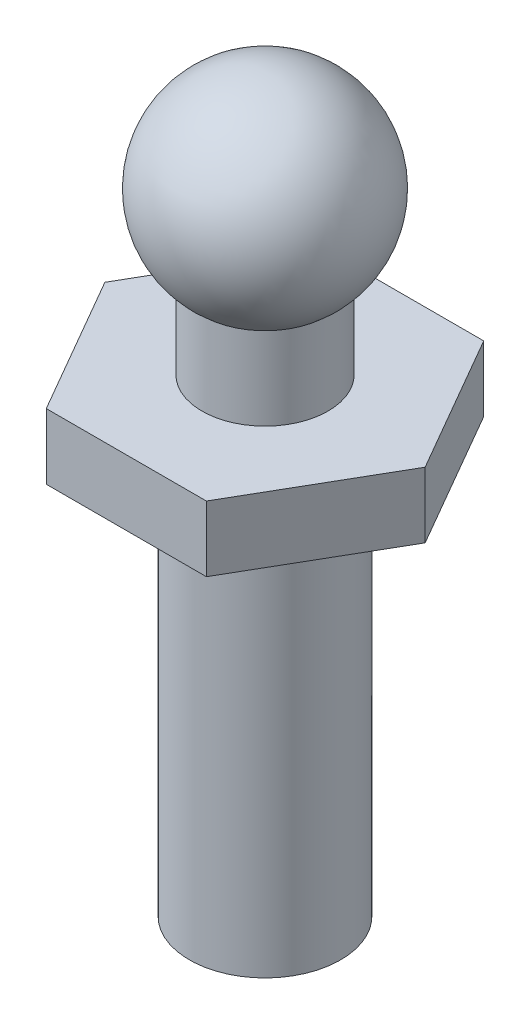
ISO-10303-21;
HEADER;
FILE_DESCRIPTION(('STEP AP214'),'2;1');
FILE_NAME('part.step','',(''),(''),'','','');
FILE_SCHEMA(('AUTOMOTIVE_DESIGN { 1 0 10303 214 1 1 1 1 }'));
ENDSEC;
DATA;
#1=APPLICATION_CONTEXT('core data for automotive mechanical design processes');
#2=APPLICATION_PROTOCOL_DEFINITION('international standard','automotive_design',2000,#1);
#3=PRODUCT_CONTEXT('',#1,'mechanical');
#4=PRODUCT('Part','Part','',(#3));
#5=PRODUCT_RELATED_PRODUCT_CATEGORY('part','',(#4));
#6=PRODUCT_DEFINITION_FORMATION('','',#4);
#7=PRODUCT_DEFINITION_CONTEXT('part definition',#1,'design');
#8=PRODUCT_DEFINITION('design','',#6,#7);
#9=PRODUCT_DEFINITION_SHAPE('','',#8);
#10=(LENGTH_UNIT() NAMED_UNIT(*) SI_UNIT(.MILLI.,.METRE.));
#11=(NAMED_UNIT(*) PLANE_ANGLE_UNIT() SI_UNIT($,.RADIAN.));
#12=(NAMED_UNIT(*) SI_UNIT($,.STERADIAN.) SOLID_ANGLE_UNIT());
#13=UNCERTAINTY_MEASURE_WITH_UNIT(LENGTH_MEASURE(1.E-05),#10,'distance_accuracy_value','');
#14=(GEOMETRIC_REPRESENTATION_CONTEXT(3) GLOBAL_UNCERTAINTY_ASSIGNED_CONTEXT((#13)) GLOBAL_UNIT_ASSIGNED_CONTEXT((#10,
#11,#12)) REPRESENTATION_CONTEXT('',''));
#15=CARTESIAN_POINT('',(0.,0.,0.));
#16=DIRECTION('',(0.,0.,1.));
#17=DIRECTION('',(1.,0.,0.));
#18=AXIS2_PLACEMENT_3D('',#15,#16,#17);
#19=CARTESIAN_POINT('',(0.,-12.5,0.));
#20=DIRECTION('',(0.,-1.,0.));
#21=DIRECTION('',(0.,0.,-1.));
#22=AXIS2_PLACEMENT_3D('',#19,#20,#21);
#23=PLANE('',#22);
#24=CARTESIAN_POINT('',(0.,-12.5,0.));
#25=DIRECTION('',(0.,-1.,0.));
#26=DIRECTION('',(0.,0.,-1.));
#27=AXIS2_PLACEMENT_3D('',#24,#25,#26);
#28=CIRCLE('',#27,1.5);
#29=CARTESIAN_POINT('',(0.,-12.5,-1.5));
#30=VERTEX_POINT('',#29);
#31=EDGE_CURVE('E11',#30,#30,#28,.T.);
#32=ORIENTED_EDGE('',*,*,#31,.T.);
#33=EDGE_LOOP('',(#32));
#34=FACE_BOUND('',#33,.T.);
#35=ADVANCED_FACE('F32',(#34),#23,.T.);
#36=CARTESIAN_POINT('',(0.,0.,0.));
#37=DIRECTION('',(0.,-1.,0.));
#38=DIRECTION('',(0.,0.,-1.));
#39=AXIS2_PLACEMENT_3D('',#36,#37,#38);
#40=CYLINDRICAL_SURFACE('',#39,1.5);
#41=CARTESIAN_POINT('',(0.,-4.5,0.));
#42=DIRECTION('',(0.,-1.,0.));
#43=DIRECTION('',(0.,0.,-1.));
#44=AXIS2_PLACEMENT_3D('',#41,#42,#43);
#45=CIRCLE('',#44,1.5);
#46=CARTESIAN_POINT('',(0.,-4.5,-1.5));
#47=VERTEX_POINT('',#46);
#48=EDGE_CURVE('E41',#47,#47,#45,.T.);
#49=ORIENTED_EDGE('',*,*,#48,.T.);
#50=EDGE_LOOP('',(#49));
#51=FACE_BOUND('',#50,.T.);
#52=ORIENTED_EDGE('',*,*,#31,.F.);
#53=EDGE_LOOP('',(#52));
#54=FACE_BOUND('',#53,.T.);
#55=ADVANCED_FACE('F125',(#51,#54),#40,.T.);
#56=CARTESIAN_POINT('',(1.5,-4.5,0.));
#57=DIRECTION('',(0.,-1.,0.));
#58=DIRECTION('',(0.,0.,-1.));
#59=AXIS2_PLACEMENT_3D('',#56,#57,#58);
#60=PLANE('',#59);
#61=DIRECTION('',(-0.5,0.,0.866025403784439));
#62=VECTOR('',#61,1.);
#63=CARTESIAN_POINT('',(-1.58771324027147,-4.5,-2.75));
#64=LINE('',#63,#62);
#65=CARTESIAN_POINT('',(-1.58771324027147,-4.5,-2.75));
#66=VERTEX_POINT('',#65);
#67=CARTESIAN_POINT('',(-3.17542648054294,-4.5,0.));
#68=VERTEX_POINT('',#67);
#69=EDGE_CURVE('E76',#66,#68,#64,.T.);
#70=ORIENTED_EDGE('',*,*,#69,.F.);
#71=DIRECTION('',(-1.,0.,0.));
#72=VECTOR('',#71,1.);
#73=CARTESIAN_POINT('',(1.58771324027147,-4.5,-2.75));
#74=LINE('',#73,#72);
#75=CARTESIAN_POINT('',(1.58771324027147,-4.5,-2.75));
#76=VERTEX_POINT('',#75);
#77=EDGE_CURVE('E106',#76,#66,#74,.T.);
#78=ORIENTED_EDGE('',*,*,#77,.F.);
#79=DIRECTION('',(-0.5,0.,-0.866025403784438));
#80=VECTOR('',#79,1.);
#81=CARTESIAN_POINT('',(3.17542648054294,-4.5,0.));
#82=LINE('',#81,#80);
#83=CARTESIAN_POINT('',(3.17542648054294,-4.5,0.));
#84=VERTEX_POINT('',#83);
#85=EDGE_CURVE('E117',#84,#76,#82,.T.);
#86=ORIENTED_EDGE('',*,*,#85,.F.);
#87=DIRECTION('',(0.5,0.,-0.866025403784439));
#88=VECTOR('',#87,1.);
#89=CARTESIAN_POINT('',(1.58771324027147,-4.5,2.75));
#90=LINE('',#89,#88);
#91=CARTESIAN_POINT('',(1.58771324027147,-4.5,2.75));
#92=VERTEX_POINT('',#91);
#93=EDGE_CURVE('E257',#92,#84,#90,.T.);
#94=ORIENTED_EDGE('',*,*,#93,.F.);
#95=DIRECTION('',(1.,0.,0.));
#96=VECTOR('',#95,1.);
#97=CARTESIAN_POINT('',(-1.58771324027147,-4.5,2.75));
#98=LINE('',#97,#96);
#99=CARTESIAN_POINT('',(-1.58771324027147,-4.5,2.75));
#100=VERTEX_POINT('',#99);
#101=EDGE_CURVE('E264',#100,#92,#98,.T.);
#102=ORIENTED_EDGE('',*,*,#101,.F.);
#103=DIRECTION('',(0.500000000000001,0.,0.866025403784438));
#104=VECTOR('',#103,1.);
#105=CARTESIAN_POINT('',(-3.17542648054294,-4.5,0.));
#106=LINE('',#105,#104);
#107=EDGE_CURVE('E72',#68,#100,#106,.T.);
#108=ORIENTED_EDGE('',*,*,#107,.F.);
#109=EDGE_LOOP('',(#70,#78,#86,#94,#102,#108));
#110=FACE_BOUND('',#109,.T.);
#111=ORIENTED_EDGE('',*,*,#48,.F.);
#112=EDGE_LOOP('',(#111));
#113=FACE_BOUND('',#112,.T.);
#114=ADVANCED_FACE('F128',(#110,#113),#60,.T.);
#115=CARTESIAN_POINT('',(1.58771324027147,-12.9013887740857,-2.75));
#116=DIRECTION('',(0.,0.,-1.));
#117=DIRECTION('',(-1.,0.,0.));
#118=AXIS2_PLACEMENT_3D('',#115,#116,#117);
#119=PLANE('',#118);
#120=DIRECTION('',(-1.,0.,0.));
#121=VECTOR('',#120,1.);
#122=CARTESIAN_POINT('',(1.58771324027147,-3.2,-2.75));
#123=LINE('',#122,#121);
#124=CARTESIAN_POINT('',(1.58771324027147,-3.2,-2.75));
#125=VERTEX_POINT('',#124);
#126=CARTESIAN_POINT('',(-1.58771324027147,-3.2,-2.75));
#127=VERTEX_POINT('',#126);
#128=EDGE_CURVE('E49',#125,#127,#123,.T.);
#129=ORIENTED_EDGE('',*,*,#128,.F.);
#130=DIRECTION('',(0.,1.,0.));
#131=VECTOR('',#130,1.);
#132=CARTESIAN_POINT('',(1.58771324027147,-12.9013887740857,-2.75));
#133=LINE('',#132,#131);
#134=EDGE_CURVE('E114',#76,#125,#133,.T.);
#135=ORIENTED_EDGE('',*,*,#134,.F.);
#136=ORIENTED_EDGE('',*,*,#77,.T.);
#137=DIRECTION('',(0.,1.,0.));
#138=VECTOR('',#137,1.);
#139=CARTESIAN_POINT('',(-1.58771324027147,-12.9013887740857,-2.75));
#140=LINE('',#139,#138);
#141=EDGE_CURVE('E96',#66,#127,#140,.T.);
#142=ORIENTED_EDGE('',*,*,#141,.T.);
#143=EDGE_LOOP('',(#129,#135,#136,#142));
#144=FACE_BOUND('',#143,.T.);
#145=ADVANCED_FACE('F105',(#144),#119,.T.);
#146=CARTESIAN_POINT('',(-1.58771324027147,-12.9013887740857,-2.75));
#147=DIRECTION('',(-0.866025403784439,0.,-0.5));
#148=DIRECTION('',(-0.5,0.,0.866025403784439));
#149=AXIS2_PLACEMENT_3D('',#146,#147,#148);
#150=PLANE('',#149);
#151=DIRECTION('',(-0.5,0.,0.866025403784439));
#152=VECTOR('',#151,1.);
#153=CARTESIAN_POINT('',(-1.58771324027147,-3.2,-2.75));
#154=LINE('',#153,#152);
#155=CARTESIAN_POINT('',(-3.17542648054294,-3.2,0.));
#156=VERTEX_POINT('',#155);
#157=EDGE_CURVE('E94',#127,#156,#154,.T.);
#158=ORIENTED_EDGE('',*,*,#157,.F.);
#159=ORIENTED_EDGE('',*,*,#141,.F.);
#160=ORIENTED_EDGE('',*,*,#69,.T.);
#161=DIRECTION('',(0.,1.,0.));
#162=VECTOR('',#161,1.);
#163=CARTESIAN_POINT('',(-3.17542648054294,-12.9013887740857,0.));
#164=LINE('',#163,#162);
#165=EDGE_CURVE('E97',#68,#156,#164,.T.);
#166=ORIENTED_EDGE('',*,*,#165,.T.);
#167=EDGE_LOOP('',(#158,#159,#160,#166));
#168=FACE_BOUND('',#167,.T.);
#169=ADVANCED_FACE('F95',(#168),#150,.T.);
#170=CARTESIAN_POINT('',(-3.17542648054294,-12.9013887740857,0.));
#171=DIRECTION('',(-0.866025403784438,0.,0.500000000000001));
#172=DIRECTION('',(0.500000000000001,0.,0.866025403784438));
#173=AXIS2_PLACEMENT_3D('',#170,#171,#172);
#174=PLANE('',#173);
#175=DIRECTION('',(0.5,0.,0.866025403784438));
#176=VECTOR('',#175,1.);
#177=CARTESIAN_POINT('',(-3.17542648054294,-3.2,0.));
#178=LINE('',#177,#176);
#179=CARTESIAN_POINT('',(-1.58771324027147,-3.2,2.75));
#180=VERTEX_POINT('',#179);
#181=EDGE_CURVE('E88',#156,#180,#178,.T.);
#182=ORIENTED_EDGE('',*,*,#181,.F.);
#183=ORIENTED_EDGE('',*,*,#165,.F.);
#184=ORIENTED_EDGE('',*,*,#107,.T.);
#185=DIRECTION('',(0.,1.,0.));
#186=VECTOR('',#185,1.);
#187=CARTESIAN_POINT('',(-1.58771324027147,-12.9013887740857,2.75));
#188=LINE('',#187,#186);
#189=EDGE_CURVE('E265',#100,#180,#188,.T.);
#190=ORIENTED_EDGE('',*,*,#189,.T.);
#191=EDGE_LOOP('',(#182,#183,#184,#190));
#192=FACE_BOUND('',#191,.T.);
#193=ADVANCED_FACE('F181',(#192),#174,.T.);
#194=CARTESIAN_POINT('',(-1.58771324027147,-12.9013887740857,2.75));
#195=DIRECTION('',(0.,0.,1.));
#196=DIRECTION('',(1.,0.,0.));
#197=AXIS2_PLACEMENT_3D('',#194,#195,#196);
#198=PLANE('',#197);
#199=DIRECTION('',(0.,1.,0.));
#200=VECTOR('',#199,1.);
#201=CARTESIAN_POINT('',(1.58771324027147,-12.9013887740857,2.75));
#202=LINE('',#201,#200);
#203=CARTESIAN_POINT('',(1.58771324027147,-3.2,2.75));
#204=VERTEX_POINT('',#203);
#205=EDGE_CURVE('E260',#92,#204,#202,.T.);
#206=ORIENTED_EDGE('',*,*,#205,.T.);
#207=DIRECTION('',(1.,0.,0.));
#208=VECTOR('',#207,1.);
#209=CARTESIAN_POINT('',(-1.58771324027147,-3.2,2.75));
#210=LINE('',#209,#208);
#211=EDGE_CURVE('E252',#180,#204,#210,.T.);
#212=ORIENTED_EDGE('',*,*,#211,.F.);
#213=ORIENTED_EDGE('',*,*,#189,.F.);
#214=ORIENTED_EDGE('',*,*,#101,.T.);
#215=EDGE_LOOP('',(#206,#212,#213,#214));
#216=FACE_BOUND('',#215,.T.);
#217=ADVANCED_FACE('F190',(#216),#198,.T.);
#218=CARTESIAN_POINT('',(1.58771324027147,-12.9013887740857,2.75));
#219=DIRECTION('',(0.866025403784439,0.,0.5));
#220=DIRECTION('',(0.5,0.,-0.866025403784439));
#221=AXIS2_PLACEMENT_3D('',#218,#219,#220);
#222=PLANE('',#221);
#223=DIRECTION('',(0.5,0.,-0.866025403784439));
#224=VECTOR('',#223,1.);
#225=CARTESIAN_POINT('',(1.58771324027147,-3.2,2.75));
#226=LINE('',#225,#224);
#227=CARTESIAN_POINT('',(3.17542648054294,-3.2,0.));
#228=VERTEX_POINT('',#227);
#229=EDGE_CURVE('E109',#204,#228,#226,.T.);
#230=ORIENTED_EDGE('',*,*,#229,.F.);
#231=ORIENTED_EDGE('',*,*,#205,.F.);
#232=ORIENTED_EDGE('',*,*,#93,.T.);
#233=DIRECTION('',(0.,1.,0.));
#234=VECTOR('',#233,1.);
#235=CARTESIAN_POINT('',(3.17542648054294,-12.9013887740857,0.));
#236=LINE('',#235,#234);
#237=EDGE_CURVE('E248',#84,#228,#236,.T.);
#238=ORIENTED_EDGE('',*,*,#237,.T.);
#239=EDGE_LOOP('',(#230,#231,#232,#238));
#240=FACE_BOUND('',#239,.T.);
#241=ADVANCED_FACE('F199',(#240),#222,.T.);
#242=CARTESIAN_POINT('',(3.17542648054294,-12.9013887740857,0.));
#243=DIRECTION('',(0.866025403784438,0.,-0.5));
#244=DIRECTION('',(-0.5,0.,-0.866025403784438));
#245=AXIS2_PLACEMENT_3D('',#242,#243,#244);
#246=PLANE('',#245);
#247=DIRECTION('',(-0.5,0.,-0.866025403784438));
#248=VECTOR('',#247,1.);
#249=CARTESIAN_POINT('',(3.17542648054294,-3.2,0.));
#250=LINE('',#249,#248);
#251=EDGE_CURVE('E102',#228,#125,#250,.T.);
#252=ORIENTED_EDGE('',*,*,#251,.F.);
#253=ORIENTED_EDGE('',*,*,#237,.F.);
#254=ORIENTED_EDGE('',*,*,#85,.T.);
#255=ORIENTED_EDGE('',*,*,#134,.T.);
#256=EDGE_LOOP('',(#252,#253,#254,#255));
#257=FACE_BOUND('',#256,.T.);
#258=ADVANCED_FACE('F209',(#257),#246,.T.);
#259=CARTESIAN_POINT('',(0.,0.,0.));
#260=DIRECTION('',(0.,-1.,0.));
#261=DIRECTION('',(1.,0.,0.));
#262=AXIS2_PLACEMENT_3D('',#259,#260,#261);
#263=SPHERICAL_SURFACE('',#262,2.);
#264=CARTESIAN_POINT('',(0.,-1.5612494995996,0.));
#265=DIRECTION('',(0.,-1.,0.));
#266=DIRECTION('',(0.,0.,-1.));
#267=AXIS2_PLACEMENT_3D('',#264,#265,#266);
#268=CIRCLE('',#267,1.25);
#269=CARTESIAN_POINT('',(0.,-1.5612494995996,-1.25));
#270=VERTEX_POINT('',#269);
#271=EDGE_CURVE('E116',#270,#270,#268,.T.);
#272=ORIENTED_EDGE('',*,*,#271,.F.);
#273=EDGE_LOOP('',(#272));
#274=FACE_BOUND('',#273,.T.);
#275=ADVANCED_FACE('F34',(#274),#263,.T.);
#276=CARTESIAN_POINT('',(0.,0.,0.));
#277=DIRECTION('',(0.,-1.,0.));
#278=DIRECTION('',(0.,0.,-1.));
#279=AXIS2_PLACEMENT_3D('',#276,#277,#278);
#280=CYLINDRICAL_SURFACE('',#279,1.25);
#281=ORIENTED_EDGE('',*,*,#271,.T.);
#282=EDGE_LOOP('',(#281));
#283=FACE_BOUND('',#282,.T.);
#284=CARTESIAN_POINT('',(0.,-3.2,0.));
#285=DIRECTION('',(0.,-1.,0.));
#286=DIRECTION('',(0.,0.,-1.));
#287=AXIS2_PLACEMENT_3D('',#284,#285,#286);
#288=CIRCLE('',#287,1.25);
#289=CARTESIAN_POINT('',(0.,-3.2,-1.25));
#290=VERTEX_POINT('',#289);
#291=EDGE_CURVE('E120',#290,#290,#288,.T.);
#292=ORIENTED_EDGE('',*,*,#291,.F.);
#293=EDGE_LOOP('',(#292));
#294=FACE_BOUND('',#293,.T.);
#295=ADVANCED_FACE('F154',(#283,#294),#280,.T.);
#296=CARTESIAN_POINT('',(2.75,-3.2,0.));
#297=DIRECTION('',(0.,1.,0.));
#298=DIRECTION('',(0.,0.,1.));
#299=AXIS2_PLACEMENT_3D('',#296,#297,#298);
#300=PLANE('',#299);
#301=ORIENTED_EDGE('',*,*,#291,.T.);
#302=EDGE_LOOP('',(#301));
#303=FACE_BOUND('',#302,.T.);
#304=ORIENTED_EDGE('',*,*,#229,.T.);
#305=ORIENTED_EDGE('',*,*,#251,.T.);
#306=ORIENTED_EDGE('',*,*,#128,.T.);
#307=ORIENTED_EDGE('',*,*,#157,.T.);
#308=ORIENTED_EDGE('',*,*,#181,.T.);
#309=ORIENTED_EDGE('',*,*,#211,.T.);
#310=EDGE_LOOP('',(#304,#305,#306,#307,#308,#309));
#311=FACE_BOUND('',#310,.T.);
#312=ADVANCED_FACE('F101',(#303,#311),#300,.T.);
#313=CLOSED_SHELL('',(#35,#55,#114,#145,#169,#193,#217,#241,#258,#275,#295,#312));
#314=MANIFOLD_SOLID_BREP('B2',#313);
#315=ADVANCED_BREP_SHAPE_REPRESENTATION('',(#18,#314),#14);
#316=SHAPE_DEFINITION_REPRESENTATION(#9,#315);
ENDSEC;
END-ISO-10303-21;
